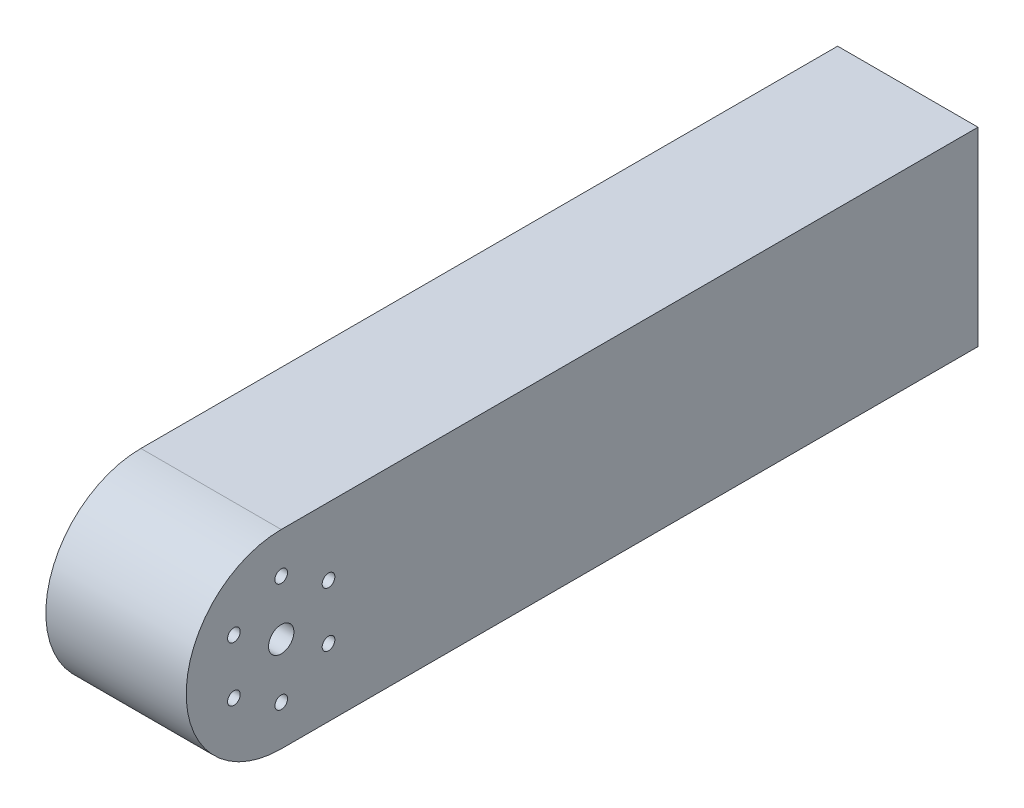
ISO-10303-21;
HEADER;
FILE_DESCRIPTION(('STEP AP214'),'2;1');
FILE_NAME('part.step','',(''),(''),'','','');
FILE_SCHEMA(('AUTOMOTIVE_DESIGN { 1 0 10303 214 1 1 1 1 }'));
ENDSEC;
DATA;
#1=APPLICATION_CONTEXT('core data for automotive mechanical design processes');
#2=APPLICATION_PROTOCOL_DEFINITION('international standard','automotive_design',2000,#1);
#3=PRODUCT_CONTEXT('',#1,'mechanical');
#4=PRODUCT('Part','Part','',(#3));
#5=PRODUCT_RELATED_PRODUCT_CATEGORY('part','',(#4));
#6=PRODUCT_DEFINITION_FORMATION('','',#4);
#7=PRODUCT_DEFINITION_CONTEXT('part definition',#1,'design');
#8=PRODUCT_DEFINITION('design','',#6,#7);
#9=PRODUCT_DEFINITION_SHAPE('','',#8);
#10=(LENGTH_UNIT() NAMED_UNIT(*) SI_UNIT(.MILLI.,.METRE.));
#11=(NAMED_UNIT(*) PLANE_ANGLE_UNIT() SI_UNIT($,.RADIAN.));
#12=(NAMED_UNIT(*) SI_UNIT($,.STERADIAN.) SOLID_ANGLE_UNIT());
#13=UNCERTAINTY_MEASURE_WITH_UNIT(LENGTH_MEASURE(1.E-05),#10,'distance_accuracy_value','');
#14=(GEOMETRIC_REPRESENTATION_CONTEXT(3) GLOBAL_UNCERTAINTY_ASSIGNED_CONTEXT((#13)) GLOBAL_UNIT_ASSIGNED_CONTEXT((#10,
#11,#12)) REPRESENTATION_CONTEXT('',''));
#15=CARTESIAN_POINT('',(0.,0.,0.));
#16=DIRECTION('',(0.,0.,1.));
#17=DIRECTION('',(1.,0.,0.));
#18=AXIS2_PLACEMENT_3D('',#15,#16,#17);
#19=CARTESIAN_POINT('',(0.,0.,95.));
#20=DIRECTION('',(-1.,0.,0.));
#21=DIRECTION('',(0.,0.,1.));
#22=AXIS2_PLACEMENT_3D('',#19,#20,#21);
#23=CYLINDRICAL_SURFACE('',#22,30.);
#24=DIRECTION('',(-1.,0.,0.));
#25=VECTOR('',#24,1.);
#26=CARTESIAN_POINT('',(44.32,30.,95.));
#27=LINE('',#26,#25);
#28=CARTESIAN_POINT('',(0.,30.,95.));
#29=VERTEX_POINT('',#28);
#30=CARTESIAN_POINT('',(44.32,30.,95.));
#31=VERTEX_POINT('',#30);
#32=EDGE_CURVE('E86',#29,#31,#27,.F.);
#33=ORIENTED_EDGE('',*,*,#32,.F.);
#34=CARTESIAN_POINT('',(0.,0.,95.));
#35=DIRECTION('',(1.,0.,0.));
#36=DIRECTION('',(0.,0.,-1.));
#37=AXIS2_PLACEMENT_3D('',#34,#35,#36);
#38=CIRCLE('',#37,30.);
#39=CARTESIAN_POINT('',(0.,-30.,95.));
#40=VERTEX_POINT('',#39);
#41=EDGE_CURVE('E60',#40,#29,#38,.F.);
#42=ORIENTED_EDGE('',*,*,#41,.F.);
#43=DIRECTION('',(-1.,0.,0.));
#44=VECTOR('',#43,1.);
#45=CARTESIAN_POINT('',(44.32,-30.,95.));
#46=LINE('',#45,#44);
#47=CARTESIAN_POINT('',(44.32,-30.,95.));
#48=VERTEX_POINT('',#47);
#49=EDGE_CURVE('E103',#48,#40,#46,.T.);
#50=ORIENTED_EDGE('',*,*,#49,.F.);
#51=CARTESIAN_POINT('',(44.32,0.,95.));
#52=DIRECTION('',(1.,0.,0.));
#53=DIRECTION('',(0.,0.,-1.));
#54=AXIS2_PLACEMENT_3D('',#51,#52,#53);
#55=CIRCLE('',#54,30.);
#56=EDGE_CURVE('E47',#31,#48,#55,.T.);
#57=ORIENTED_EDGE('',*,*,#56,.F.);
#58=EDGE_LOOP('',(#33,#42,#50,#57));
#59=FACE_BOUND('',#58,.T.);
#60=ADVANCED_FACE('F39',(#59),#23,.T.);
#61=CARTESIAN_POINT('',(44.32,30.,-125.));
#62=DIRECTION('',(0.,0.,1.));
#63=DIRECTION('',(0.,-1.,0.));
#64=AXIS2_PLACEMENT_3D('',#61,#62,#63);
#65=PLANE('',#64);
#66=CARTESIAN_POINT('',(22.4369322433506,0.,-125.));
#67=DIRECTION('',(0.,0.,1.));
#68=DIRECTION('',(0.,-1.,0.));
#69=AXIS2_PLACEMENT_3D('',#66,#67,#68);
#70=CIRCLE('',#69,1.);
#71=CARTESIAN_POINT('',(22.4369322433506,-0.999999999999944,-125.));
#72=VERTEX_POINT('',#71);
#73=EDGE_CURVE('E11',#72,#72,#70,.F.);
#74=ORIENTED_EDGE('',*,*,#73,.F.);
#75=EDGE_LOOP('',(#74));
#76=FACE_BOUND('',#75,.T.);
#77=DIRECTION('',(0.,1.,0.));
#78=VECTOR('',#77,1.);
#79=CARTESIAN_POINT('',(0.,30.,-125.));
#80=LINE('',#79,#78);
#81=CARTESIAN_POINT('',(0.,-30.,-125.));
#82=VERTEX_POINT('',#81);
#83=CARTESIAN_POINT('',(0.,30.,-125.));
#84=VERTEX_POINT('',#83);
#85=EDGE_CURVE('E100',#82,#84,#80,.T.);
#86=ORIENTED_EDGE('',*,*,#85,.T.);
#87=DIRECTION('',(-1.,0.,0.));
#88=VECTOR('',#87,1.);
#89=CARTESIAN_POINT('',(44.32,30.,-125.));
#90=LINE('',#89,#88);
#91=CARTESIAN_POINT('',(44.32,30.,-125.));
#92=VERTEX_POINT('',#91);
#93=EDGE_CURVE('E84',#92,#84,#90,.T.);
#94=ORIENTED_EDGE('',*,*,#93,.F.);
#95=DIRECTION('',(0.,1.,0.));
#96=VECTOR('',#95,1.);
#97=CARTESIAN_POINT('',(44.32,30.,-125.));
#98=LINE('',#97,#96);
#99=CARTESIAN_POINT('',(44.32,-30.,-125.));
#100=VERTEX_POINT('',#99);
#101=EDGE_CURVE('E88',#100,#92,#98,.T.);
#102=ORIENTED_EDGE('',*,*,#101,.F.);
#103=DIRECTION('',(-1.,0.,0.));
#104=VECTOR('',#103,1.);
#105=CARTESIAN_POINT('',(44.32,-30.,-125.));
#106=LINE('',#105,#104);
#107=EDGE_CURVE('E101',#100,#82,#106,.T.);
#108=ORIENTED_EDGE('',*,*,#107,.T.);
#109=EDGE_LOOP('',(#86,#94,#102,#108));
#110=FACE_BOUND('',#109,.T.);
#111=ADVANCED_FACE('F98',(#76,#110),#65,.F.);
#112=CARTESIAN_POINT('',(44.32,30.,125.));
#113=DIRECTION('',(0.,-1.,0.));
#114=DIRECTION('',(0.,0.,-1.));
#115=AXIS2_PLACEMENT_3D('',#112,#113,#114);
#116=PLANE('',#115);
#117=DIRECTION('',(0.,0.,1.));
#118=VECTOR('',#117,1.);
#119=CARTESIAN_POINT('',(0.,30.,125.));
#120=LINE('',#119,#118);
#121=EDGE_CURVE('E112',#84,#29,#120,.T.);
#122=ORIENTED_EDGE('',*,*,#121,.T.);
#123=ORIENTED_EDGE('',*,*,#32,.T.);
#124=DIRECTION('',(0.,0.,1.));
#125=VECTOR('',#124,1.);
#126=CARTESIAN_POINT('',(44.32,30.,125.));
#127=LINE('',#126,#125);
#128=EDGE_CURVE('E79',#92,#31,#127,.T.);
#129=ORIENTED_EDGE('',*,*,#128,.F.);
#130=ORIENTED_EDGE('',*,*,#93,.T.);
#131=EDGE_LOOP('',(#122,#123,#129,#130));
#132=FACE_BOUND('',#131,.T.);
#133=ADVANCED_FACE('F82',(#132),#116,.F.);
#134=CARTESIAN_POINT('',(44.32,-30.,125.));
#135=DIRECTION('',(0.,1.,0.));
#136=DIRECTION('',(0.,0.,1.));
#137=AXIS2_PLACEMENT_3D('',#134,#135,#136);
#138=PLANE('',#137);
#139=DIRECTION('',(0.,0.,-1.));
#140=VECTOR('',#139,1.);
#141=CARTESIAN_POINT('',(44.32,-30.,125.));
#142=LINE('',#141,#140);
#143=EDGE_CURVE('E87',#48,#100,#142,.T.);
#144=ORIENTED_EDGE('',*,*,#143,.F.);
#145=ORIENTED_EDGE('',*,*,#49,.T.);
#146=DIRECTION('',(0.,0.,-1.));
#147=VECTOR('',#146,1.);
#148=CARTESIAN_POINT('',(0.,-30.,125.));
#149=LINE('',#148,#147);
#150=EDGE_CURVE('E96',#40,#82,#149,.T.);
#151=ORIENTED_EDGE('',*,*,#150,.T.);
#152=ORIENTED_EDGE('',*,*,#107,.F.);
#153=EDGE_LOOP('',(#144,#145,#151,#152));
#154=FACE_BOUND('',#153,.T.);
#155=ADVANCED_FACE('F190',(#154),#138,.F.);
#156=CARTESIAN_POINT('',(44.32,0.,0.));
#157=DIRECTION('',(1.,0.,0.));
#158=DIRECTION('',(0.,0.,-1.));
#159=AXIS2_PLACEMENT_3D('',#156,#157,#158);
#160=PLANE('',#159);
#161=CARTESIAN_POINT('',(44.32,0.,95.0000000000006));
#162=DIRECTION('',(1.,0.,0.));
#163=DIRECTION('',(0.,0.,-1.));
#164=AXIS2_PLACEMENT_3D('',#161,#162,#163);
#165=CIRCLE('',#164,4.00000000000001);
#166=CARTESIAN_POINT('',(44.32,0.,91.0000000000006));
#167=VERTEX_POINT('',#166);
#168=EDGE_CURVE('E152',#167,#167,#165,.T.);
#169=ORIENTED_EDGE('',*,*,#168,.F.);
#170=EDGE_LOOP('',(#169));
#171=FACE_BOUND('',#170,.T.);
#172=CARTESIAN_POINT('',(44.32,17.25,94.9999999999999));
#173=DIRECTION('',(1.,0.,0.));
#174=DIRECTION('',(0.,0.,-1.));
#175=AXIS2_PLACEMENT_3D('',#172,#173,#174);
#176=CIRCLE('',#175,2.);
#177=CARTESIAN_POINT('',(44.32,17.25,92.9999999999999));
#178=VERTEX_POINT('',#177);
#179=EDGE_CURVE('E120',#178,#178,#176,.F.);
#180=ORIENTED_EDGE('',*,*,#179,.T.);
#181=EDGE_LOOP('',(#180));
#182=FACE_BOUND('',#181,.T.);
#183=CARTESIAN_POINT('',(44.32,8.6250000000006,109.938938215282));
#184=DIRECTION('',(1.,0.,0.));
#185=DIRECTION('',(0.,0.,-1.));
#186=AXIS2_PLACEMENT_3D('',#183,#184,#185);
#187=CIRCLE('',#186,2.);
#188=CARTESIAN_POINT('',(44.32,8.6250000000006,107.938938215282));
#189=VERTEX_POINT('',#188);
#190=EDGE_CURVE('E149',#189,#189,#187,.F.);
#191=ORIENTED_EDGE('',*,*,#190,.T.);
#192=EDGE_LOOP('',(#191));
#193=FACE_BOUND('',#192,.T.);
#194=CARTESIAN_POINT('',(44.32,-8.62499999999945,109.938938215283));
#195=DIRECTION('',(1.,0.,0.));
#196=DIRECTION('',(0.,0.,-1.));
#197=AXIS2_PLACEMENT_3D('',#194,#195,#196);
#198=CIRCLE('',#197,2.);
#199=CARTESIAN_POINT('',(44.32,-8.62499999999945,107.938938215283));
#200=VERTEX_POINT('',#199);
#201=EDGE_CURVE('E125',#200,#200,#198,.F.);
#202=ORIENTED_EDGE('',*,*,#201,.T.);
#203=EDGE_LOOP('',(#202));
#204=FACE_BOUND('',#203,.T.);
#205=CARTESIAN_POINT('',(44.32,-17.25,95.0000000000012));
#206=DIRECTION('',(1.,0.,0.));
#207=DIRECTION('',(0.,0.,-1.));
#208=AXIS2_PLACEMENT_3D('',#205,#206,#207);
#209=CIRCLE('',#208,1.99999999999999);
#210=CARTESIAN_POINT('',(44.32,-17.25,93.0000000000013));
#211=VERTEX_POINT('',#210);
#212=EDGE_CURVE('E124',#211,#211,#209,.F.);
#213=ORIENTED_EDGE('',*,*,#212,.T.);
#214=EDGE_LOOP('',(#213));
#215=FACE_BOUND('',#214,.T.);
#216=CARTESIAN_POINT('',(44.32,8.62499999999955,80.0610617847188));
#217=DIRECTION('',(1.,0.,0.));
#218=DIRECTION('',(0.,0.,-1.));
#219=AXIS2_PLACEMENT_3D('',#216,#217,#218);
#220=CIRCLE('',#219,2.00000000000001);
#221=CARTESIAN_POINT('',(44.32,8.62499999999955,78.0610617847188));
#222=VERTEX_POINT('',#221);
#223=EDGE_CURVE('E132',#222,#222,#220,.F.);
#224=ORIENTED_EDGE('',*,*,#223,.T.);
#225=EDGE_LOOP('',(#224));
#226=FACE_BOUND('',#225,.T.);
#227=CARTESIAN_POINT('',(44.32,-8.62500000000049,80.0610617847194));
#228=DIRECTION('',(1.,0.,0.));
#229=DIRECTION('',(0.,0.,-1.));
#230=AXIS2_PLACEMENT_3D('',#227,#228,#229);
#231=CIRCLE('',#230,2.);
#232=CARTESIAN_POINT('',(44.32,-8.62500000000049,78.0610617847194));
#233=VERTEX_POINT('',#232);
#234=EDGE_CURVE('E138',#233,#233,#231,.F.);
#235=ORIENTED_EDGE('',*,*,#234,.T.);
#236=EDGE_LOOP('',(#235));
#237=FACE_BOUND('',#236,.T.);
#238=ORIENTED_EDGE('',*,*,#128,.T.);
#239=ORIENTED_EDGE('',*,*,#56,.T.);
#240=ORIENTED_EDGE('',*,*,#143,.T.);
#241=ORIENTED_EDGE('',*,*,#101,.T.);
#242=EDGE_LOOP('',(#238,#239,#240,#241));
#243=FACE_BOUND('',#242,.T.);
#244=ADVANCED_FACE('F91',(#171,#182,#193,#204,#215,#226,#237,#243),#160,.T.);
#245=CARTESIAN_POINT('',(0.,0.,0.));
#246=DIRECTION('',(1.,0.,0.));
#247=DIRECTION('',(0.,0.,-1.));
#248=AXIS2_PLACEMENT_3D('',#245,#246,#247);
#249=PLANE('',#248);
#250=CARTESIAN_POINT('',(0.,0.,95.0000000000006));
#251=DIRECTION('',(-1.,0.,0.));
#252=DIRECTION('',(0.,0.,1.));
#253=AXIS2_PLACEMENT_3D('',#250,#251,#252);
#254=CIRCLE('',#253,4.00000000000001);
#255=CARTESIAN_POINT('',(0.,0.,99.0000000000006));
#256=VERTEX_POINT('',#255);
#257=EDGE_CURVE('E159',#256,#256,#254,.T.);
#258=ORIENTED_EDGE('',*,*,#257,.F.);
#259=EDGE_LOOP('',(#258));
#260=FACE_BOUND('',#259,.T.);
#261=CARTESIAN_POINT('',(0.,17.25,94.9999999999999));
#262=DIRECTION('',(-1.,0.,0.));
#263=DIRECTION('',(0.,0.,1.));
#264=AXIS2_PLACEMENT_3D('',#261,#262,#263);
#265=CIRCLE('',#264,2.);
#266=CARTESIAN_POINT('',(0.,17.25,96.9999999999999));
#267=VERTEX_POINT('',#266);
#268=EDGE_CURVE('E144',#267,#267,#265,.T.);
#269=ORIENTED_EDGE('',*,*,#268,.F.);
#270=EDGE_LOOP('',(#269));
#271=FACE_BOUND('',#270,.T.);
#272=CARTESIAN_POINT('',(0.,8.6250000000006,109.938938215282));
#273=DIRECTION('',(-1.,0.,0.));
#274=DIRECTION('',(0.,0.,1.));
#275=AXIS2_PLACEMENT_3D('',#272,#273,#274);
#276=CIRCLE('',#275,2.);
#277=CARTESIAN_POINT('',(0.,8.6250000000006,111.938938215282));
#278=VERTEX_POINT('',#277);
#279=EDGE_CURVE('E128',#278,#278,#276,.T.);
#280=ORIENTED_EDGE('',*,*,#279,.F.);
#281=EDGE_LOOP('',(#280));
#282=FACE_BOUND('',#281,.T.);
#283=CARTESIAN_POINT('',(0.,-8.62499999999945,109.938938215283));
#284=DIRECTION('',(-1.,0.,0.));
#285=DIRECTION('',(0.,0.,1.));
#286=AXIS2_PLACEMENT_3D('',#283,#284,#285);
#287=CIRCLE('',#286,2.);
#288=CARTESIAN_POINT('',(0.,-8.62499999999945,111.938938215283));
#289=VERTEX_POINT('',#288);
#290=EDGE_CURVE('E121',#289,#289,#287,.T.);
#291=ORIENTED_EDGE('',*,*,#290,.F.);
#292=EDGE_LOOP('',(#291));
#293=FACE_BOUND('',#292,.T.);
#294=CARTESIAN_POINT('',(0.,-17.25,95.0000000000012));
#295=DIRECTION('',(-1.,0.,0.));
#296=DIRECTION('',(0.,0.,1.));
#297=AXIS2_PLACEMENT_3D('',#294,#295,#296);
#298=CIRCLE('',#297,1.99999999999999);
#299=CARTESIAN_POINT('',(0.,-17.25,97.0000000000012));
#300=VERTEX_POINT('',#299);
#301=EDGE_CURVE('E129',#300,#300,#298,.T.);
#302=ORIENTED_EDGE('',*,*,#301,.F.);
#303=EDGE_LOOP('',(#302));
#304=FACE_BOUND('',#303,.T.);
#305=CARTESIAN_POINT('',(0.,8.62499999999955,80.0610617847188));
#306=DIRECTION('',(-1.,0.,0.));
#307=DIRECTION('',(0.,0.,1.));
#308=AXIS2_PLACEMENT_3D('',#305,#306,#307);
#309=CIRCLE('',#308,2.00000000000001);
#310=CARTESIAN_POINT('',(0.,8.62499999999955,82.0610617847188));
#311=VERTEX_POINT('',#310);
#312=EDGE_CURVE('E135',#311,#311,#309,.T.);
#313=ORIENTED_EDGE('',*,*,#312,.F.);
#314=EDGE_LOOP('',(#313));
#315=FACE_BOUND('',#314,.T.);
#316=CARTESIAN_POINT('',(0.,-8.62500000000049,80.0610617847194));
#317=DIRECTION('',(-1.,0.,0.));
#318=DIRECTION('',(0.,0.,1.));
#319=AXIS2_PLACEMENT_3D('',#316,#317,#318);
#320=CIRCLE('',#319,2.);
#321=CARTESIAN_POINT('',(0.,-8.62500000000049,82.0610617847194));
#322=VERTEX_POINT('',#321);
#323=EDGE_CURVE('E141',#322,#322,#320,.T.);
#324=ORIENTED_EDGE('',*,*,#323,.F.);
#325=EDGE_LOOP('',(#324));
#326=FACE_BOUND('',#325,.T.);
#327=ORIENTED_EDGE('',*,*,#150,.F.);
#328=ORIENTED_EDGE('',*,*,#41,.T.);
#329=ORIENTED_EDGE('',*,*,#121,.F.);
#330=ORIENTED_EDGE('',*,*,#85,.F.);
#331=EDGE_LOOP('',(#327,#328,#329,#330));
#332=FACE_BOUND('',#331,.T.);
#333=ADVANCED_FACE('F111',(#260,#271,#282,#293,#304,#315,#326,#332),#249,.F.);
#334=CARTESIAN_POINT('',(22.4369322433506,0.,-128.));
#335=DIRECTION('',(0.,0.,1.));
#336=DIRECTION('',(0.,-1.,0.));
#337=AXIS2_PLACEMENT_3D('',#334,#335,#336);
#338=CYLINDRICAL_SURFACE('',#337,1.);
#339=CARTESIAN_POINT('',(22.4369322433506,0.,-128.));
#340=DIRECTION('',(0.,0.,-1.));
#341=DIRECTION('',(0.,1.,0.));
#342=AXIS2_PLACEMENT_3D('',#339,#340,#341);
#343=CIRCLE('',#342,1.);
#344=CARTESIAN_POINT('',(22.4369322433506,1.00000000000006,-128.));
#345=VERTEX_POINT('',#344);
#346=EDGE_CURVE('E114',#345,#345,#343,.T.);
#347=ORIENTED_EDGE('',*,*,#346,.F.);
#348=EDGE_LOOP('',(#347));
#349=FACE_BOUND('',#348,.T.);
#350=ORIENTED_EDGE('',*,*,#73,.T.);
#351=EDGE_LOOP('',(#350));
#352=FACE_BOUND('',#351,.T.);
#353=ADVANCED_FACE('F167',(#349,#352),#338,.T.);
#354=CARTESIAN_POINT('',(22.4369322433506,0.,-128.));
#355=DIRECTION('',(0.,0.,-1.));
#356=DIRECTION('',(0.,1.,0.));
#357=AXIS2_PLACEMENT_3D('',#354,#355,#356);
#358=PLANE('',#357);
#359=ORIENTED_EDGE('',*,*,#346,.T.);
#360=EDGE_LOOP('',(#359));
#361=FACE_BOUND('',#360,.T.);
#362=ADVANCED_FACE('F185',(#361),#358,.T.);
#363=CARTESIAN_POINT('',(49.9768542494924,-8.62500000000049,80.0610617847194));
#364=DIRECTION('',(-1.,0.,0.));
#365=DIRECTION('',(0.,0.,1.));
#366=AXIS2_PLACEMENT_3D('',#363,#364,#365);
#367=CYLINDRICAL_SURFACE('',#366,2.);
#368=ORIENTED_EDGE('',*,*,#323,.T.);
#369=EDGE_LOOP('',(#368));
#370=FACE_BOUND('',#369,.T.);
#371=ORIENTED_EDGE('',*,*,#234,.F.);
#372=EDGE_LOOP('',(#371));
#373=FACE_BOUND('',#372,.T.);
#374=ADVANCED_FACE('F181',(#370,#373),#367,.F.);
#375=CARTESIAN_POINT('',(49.9768542494924,8.62499999999955,80.0610617847188));
#376=DIRECTION('',(-1.,0.,0.));
#377=DIRECTION('',(0.,0.,1.));
#378=AXIS2_PLACEMENT_3D('',#375,#376,#377);
#379=CYLINDRICAL_SURFACE('',#378,2.00000000000001);
#380=ORIENTED_EDGE('',*,*,#312,.T.);
#381=EDGE_LOOP('',(#380));
#382=FACE_BOUND('',#381,.T.);
#383=ORIENTED_EDGE('',*,*,#223,.F.);
#384=EDGE_LOOP('',(#383));
#385=FACE_BOUND('',#384,.T.);
#386=ADVANCED_FACE('F184',(#382,#385),#379,.F.);
#387=CARTESIAN_POINT('',(49.9768542494924,-17.25,95.0000000000012));
#388=DIRECTION('',(-1.,0.,0.));
#389=DIRECTION('',(0.,0.,1.));
#390=AXIS2_PLACEMENT_3D('',#387,#388,#389);
#391=CYLINDRICAL_SURFACE('',#390,1.99999999999999);
#392=ORIENTED_EDGE('',*,*,#301,.T.);
#393=EDGE_LOOP('',(#392));
#394=FACE_BOUND('',#393,.T.);
#395=ORIENTED_EDGE('',*,*,#212,.F.);
#396=EDGE_LOOP('',(#395));
#397=FACE_BOUND('',#396,.T.);
#398=ADVANCED_FACE('F225',(#394,#397),#391,.F.);
#399=CARTESIAN_POINT('',(49.9768542494924,-8.62499999999945,109.938938215283));
#400=DIRECTION('',(-1.,0.,0.));
#401=DIRECTION('',(0.,0.,1.));
#402=AXIS2_PLACEMENT_3D('',#399,#400,#401);
#403=CYLINDRICAL_SURFACE('',#402,2.);
#404=ORIENTED_EDGE('',*,*,#290,.T.);
#405=EDGE_LOOP('',(#404));
#406=FACE_BOUND('',#405,.T.);
#407=ORIENTED_EDGE('',*,*,#201,.F.);
#408=EDGE_LOOP('',(#407));
#409=FACE_BOUND('',#408,.T.);
#410=ADVANCED_FACE('F221',(#406,#409),#403,.F.);
#411=CARTESIAN_POINT('',(49.9768542494924,8.6250000000006,109.938938215282));
#412=DIRECTION('',(-1.,0.,0.));
#413=DIRECTION('',(0.,0.,1.));
#414=AXIS2_PLACEMENT_3D('',#411,#412,#413);
#415=CYLINDRICAL_SURFACE('',#414,2.);
#416=ORIENTED_EDGE('',*,*,#279,.T.);
#417=EDGE_LOOP('',(#416));
#418=FACE_BOUND('',#417,.T.);
#419=ORIENTED_EDGE('',*,*,#190,.F.);
#420=EDGE_LOOP('',(#419));
#421=FACE_BOUND('',#420,.T.);
#422=ADVANCED_FACE('F224',(#418,#421),#415,.F.);
#423=CARTESIAN_POINT('',(49.9768542494924,17.25,94.9999999999999));
#424=DIRECTION('',(-1.,0.,0.));
#425=DIRECTION('',(0.,0.,1.));
#426=AXIS2_PLACEMENT_3D('',#423,#424,#425);
#427=CYLINDRICAL_SURFACE('',#426,2.);
#428=ORIENTED_EDGE('',*,*,#268,.T.);
#429=EDGE_LOOP('',(#428));
#430=FACE_BOUND('',#429,.T.);
#431=ORIENTED_EDGE('',*,*,#179,.F.);
#432=EDGE_LOOP('',(#431));
#433=FACE_BOUND('',#432,.T.);
#434=ADVANCED_FACE('F235',(#430,#433),#427,.F.);
#435=CARTESIAN_POINT('',(103.,0.,95.0000000000006));
#436=DIRECTION('',(-1.,0.,0.));
#437=DIRECTION('',(0.,0.,1.));
#438=AXIS2_PLACEMENT_3D('',#435,#436,#437);
#439=CYLINDRICAL_SURFACE('',#438,4.00000000000001);
#440=ORIENTED_EDGE('',*,*,#168,.T.);
#441=EDGE_LOOP('',(#440));
#442=FACE_BOUND('',#441,.T.);
#443=ORIENTED_EDGE('',*,*,#257,.T.);
#444=EDGE_LOOP('',(#443));
#445=FACE_BOUND('',#444,.T.);
#446=ADVANCED_FACE('F163',(#442,#445),#439,.F.);
#447=CLOSED_SHELL('',(#60,#111,#133,#155,#244,#333,#353,#362,#374,#386,#398,#410,#422,#434,#446));
#448=MANIFOLD_SOLID_BREP('B2',#447);
#449=ADVANCED_BREP_SHAPE_REPRESENTATION('',(#18,#448),#14);
#450=SHAPE_DEFINITION_REPRESENTATION(#9,#449);
ENDSEC;
END-ISO-10303-21;
